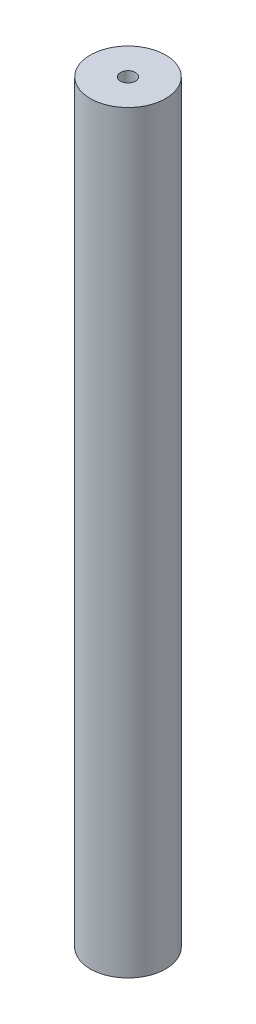
ISO-10303-21;
HEADER;
FILE_DESCRIPTION(('STEP AP214'),'2;1');
FILE_NAME('part.step','',(''),(''),'','','');
FILE_SCHEMA(('AUTOMOTIVE_DESIGN { 1 0 10303 214 1 1 1 1 }'));
ENDSEC;
DATA;
#1=APPLICATION_CONTEXT('core data for automotive mechanical design processes');
#2=APPLICATION_PROTOCOL_DEFINITION('international standard','automotive_design',2000,#1);
#3=PRODUCT_CONTEXT('',#1,'mechanical');
#4=PRODUCT('Part','Part','',(#3));
#5=PRODUCT_RELATED_PRODUCT_CATEGORY('part','',(#4));
#6=PRODUCT_DEFINITION_FORMATION('','',#4);
#7=PRODUCT_DEFINITION_CONTEXT('part definition',#1,'design');
#8=PRODUCT_DEFINITION('design','',#6,#7);
#9=PRODUCT_DEFINITION_SHAPE('','',#8);
#10=(LENGTH_UNIT() NAMED_UNIT(*) SI_UNIT(.MILLI.,.METRE.));
#11=(NAMED_UNIT(*) PLANE_ANGLE_UNIT() SI_UNIT($,.RADIAN.));
#12=(NAMED_UNIT(*) SI_UNIT($,.STERADIAN.) SOLID_ANGLE_UNIT());
#13=UNCERTAINTY_MEASURE_WITH_UNIT(LENGTH_MEASURE(1.E-05),#10,'distance_accuracy_value','');
#14=(GEOMETRIC_REPRESENTATION_CONTEXT(3) GLOBAL_UNCERTAINTY_ASSIGNED_CONTEXT((#13)) GLOBAL_UNIT_ASSIGNED_CONTEXT((#10,
#11,#12)) REPRESENTATION_CONTEXT('',''));
#15=CARTESIAN_POINT('',(0.,0.,0.));
#16=DIRECTION('',(0.,0.,1.));
#17=DIRECTION('',(1.,0.,0.));
#18=AXIS2_PLACEMENT_3D('',#15,#16,#17);
#19=CARTESIAN_POINT('',(0.,1000.,0.));
#20=DIRECTION('',(0.,1.,0.));
#21=DIRECTION('',(0.,0.,1.));
#22=AXIS2_PLACEMENT_3D('',#19,#20,#21);
#23=PLANE('',#22);
#24=CARTESIAN_POINT('',(0.,1000.,0.));
#25=DIRECTION('',(0.,1.,0.));
#26=DIRECTION('',(0.,0.,1.));
#27=AXIS2_PLACEMENT_3D('',#24,#25,#26);
#28=CIRCLE('',#27,50.);
#29=CARTESIAN_POINT('',(0.,1000.,50.));
#30=VERTEX_POINT('',#29);
#31=EDGE_CURVE('E10',#30,#30,#28,.T.);
#32=ORIENTED_EDGE('',*,*,#31,.T.);
#33=EDGE_LOOP('',(#32));
#34=FACE_BOUND('',#33,.T.);
#35=CARTESIAN_POINT('',(0.,1000.,0.));
#36=DIRECTION('',(0.,1.,0.));
#37=DIRECTION('',(0.,0.,1.));
#38=AXIS2_PLACEMENT_3D('',#35,#36,#37);
#39=CIRCLE('',#38,10.);
#40=CARTESIAN_POINT('',(0.,1000.,10.));
#41=VERTEX_POINT('',#40);
#42=EDGE_CURVE('E54',#41,#41,#39,.T.);
#43=ORIENTED_EDGE('',*,*,#42,.F.);
#44=EDGE_LOOP('',(#43));
#45=FACE_BOUND('',#44,.T.);
#46=ADVANCED_FACE('F41',(#34,#45),#23,.T.);
#47=CARTESIAN_POINT('',(0.,0.,0.));
#48=DIRECTION('',(0.,1.,0.));
#49=DIRECTION('',(0.,0.,1.));
#50=AXIS2_PLACEMENT_3D('',#47,#48,#49);
#51=PLANE('',#50);
#52=CARTESIAN_POINT('',(0.,0.,0.));
#53=DIRECTION('',(0.,1.,0.));
#54=DIRECTION('',(0.,0.,1.));
#55=AXIS2_PLACEMENT_3D('',#52,#53,#54);
#56=CIRCLE('',#55,50.);
#57=CARTESIAN_POINT('',(0.,0.,50.));
#58=VERTEX_POINT('',#57);
#59=EDGE_CURVE('E45',#58,#58,#56,.T.);
#60=ORIENTED_EDGE('',*,*,#59,.F.);
#61=EDGE_LOOP('',(#60));
#62=FACE_BOUND('',#61,.T.);
#63=CARTESIAN_POINT('',(0.,0.,0.));
#64=DIRECTION('',(0.,1.,0.));
#65=DIRECTION('',(0.,0.,1.));
#66=AXIS2_PLACEMENT_3D('',#63,#64,#65);
#67=CIRCLE('',#66,10.);
#68=CARTESIAN_POINT('',(0.,0.,10.));
#69=VERTEX_POINT('',#68);
#70=EDGE_CURVE('E56',#69,#69,#67,.T.);
#71=ORIENTED_EDGE('',*,*,#70,.T.);
#72=EDGE_LOOP('',(#71));
#73=FACE_BOUND('',#72,.T.);
#74=ADVANCED_FACE('F68',(#62,#73),#51,.F.);
#75=CARTESIAN_POINT('',(0.,1000.,0.));
#76=DIRECTION('',(0.,-1.,0.));
#77=DIRECTION('',(0.,0.,-1.));
#78=AXIS2_PLACEMENT_3D('',#75,#76,#77);
#79=CYLINDRICAL_SURFACE('',#78,50.);
#80=ORIENTED_EDGE('',*,*,#31,.F.);
#81=EDGE_LOOP('',(#80));
#82=FACE_BOUND('',#81,.T.);
#83=ORIENTED_EDGE('',*,*,#59,.T.);
#84=EDGE_LOOP('',(#83));
#85=FACE_BOUND('',#84,.T.);
#86=ADVANCED_FACE('F43',(#82,#85),#79,.T.);
#87=CARTESIAN_POINT('',(0.,1000.,0.));
#88=DIRECTION('',(0.,-1.,0.));
#89=DIRECTION('',(0.,0.,-1.));
#90=AXIS2_PLACEMENT_3D('',#87,#88,#89);
#91=CYLINDRICAL_SURFACE('',#90,10.);
#92=ORIENTED_EDGE('',*,*,#42,.T.);
#93=EDGE_LOOP('',(#92));
#94=FACE_BOUND('',#93,.T.);
#95=ORIENTED_EDGE('',*,*,#70,.F.);
#96=EDGE_LOOP('',(#95));
#97=FACE_BOUND('',#96,.T.);
#98=ADVANCED_FACE('F64',(#94,#97),#91,.F.);
#99=CLOSED_SHELL('',(#46,#74,#86,#98));
#100=MANIFOLD_SOLID_BREP('B2',#99);
#101=ADVANCED_BREP_SHAPE_REPRESENTATION('',(#18,#100),#14);
#102=SHAPE_DEFINITION_REPRESENTATION(#9,#101);
ENDSEC;
END-ISO-10303-21;
